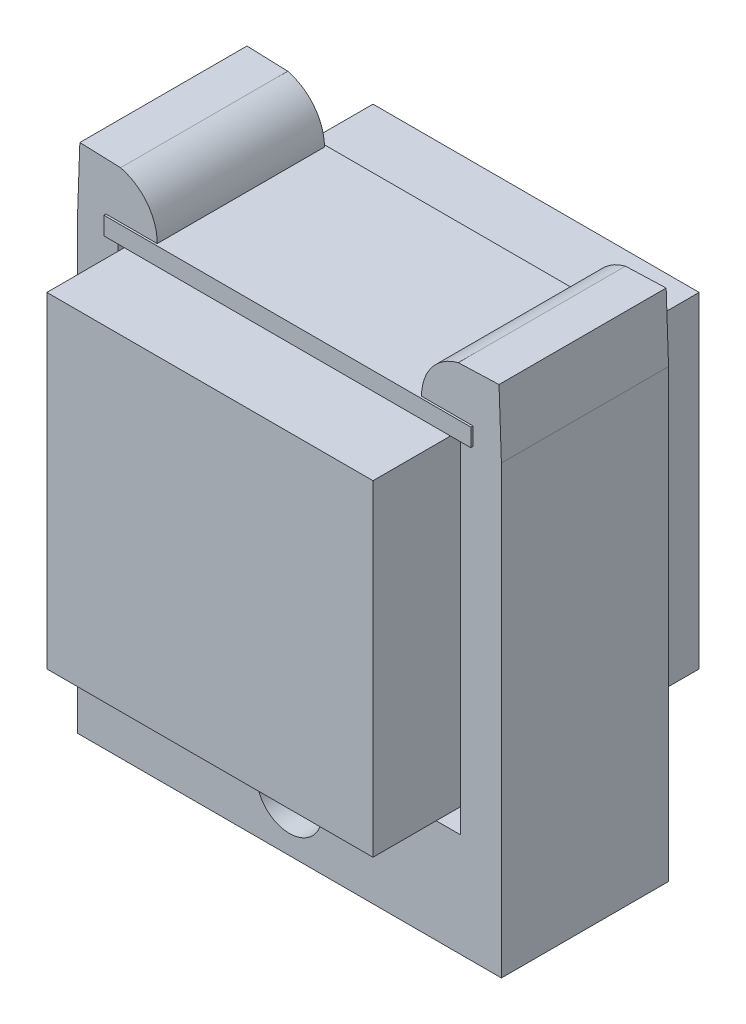
ISO-10303-21;
HEADER;
FILE_DESCRIPTION(('STEP AP214'),'2;1');
FILE_NAME('part.step','',(''),(''),'','','');
FILE_SCHEMA(('AUTOMOTIVE_DESIGN { 1 0 10303 214 1 1 1 1 }'));
ENDSEC;
DATA;
#1=APPLICATION_CONTEXT('core data for automotive mechanical design processes');
#2=APPLICATION_PROTOCOL_DEFINITION('international standard','automotive_design',2000,#1);
#3=PRODUCT_CONTEXT('',#1,'mechanical');
#4=PRODUCT('Part','Part','',(#3));
#5=PRODUCT_RELATED_PRODUCT_CATEGORY('part','',(#4));
#6=PRODUCT_DEFINITION_FORMATION('','',#4);
#7=PRODUCT_DEFINITION_CONTEXT('part definition',#1,'design');
#8=PRODUCT_DEFINITION('design','',#6,#7);
#9=PRODUCT_DEFINITION_SHAPE('','',#8);
#10=(LENGTH_UNIT() NAMED_UNIT(*) SI_UNIT(.MILLI.,.METRE.));
#11=(NAMED_UNIT(*) PLANE_ANGLE_UNIT() SI_UNIT($,.RADIAN.));
#12=(NAMED_UNIT(*) SI_UNIT($,.STERADIAN.) SOLID_ANGLE_UNIT());
#13=UNCERTAINTY_MEASURE_WITH_UNIT(LENGTH_MEASURE(1.E-05),#10,'distance_accuracy_value','');
#14=(GEOMETRIC_REPRESENTATION_CONTEXT(3) GLOBAL_UNCERTAINTY_ASSIGNED_CONTEXT((#13)) GLOBAL_UNIT_ASSIGNED_CONTEXT((#10,
#11,#12)) REPRESENTATION_CONTEXT('',''));
#15=CARTESIAN_POINT('',(0.,0.,0.));
#16=DIRECTION('',(0.,0.,1.));
#17=DIRECTION('',(1.,0.,0.));
#18=AXIS2_PLACEMENT_3D('',#15,#16,#17);
#19=CARTESIAN_POINT('',(-22.1592188142803,2.24280328604345,10.25));
#20=DIRECTION('',(0.,0.,-1.));
#21=DIRECTION('',(-1.,0.,0.));
#22=AXIS2_PLACEMENT_3D('',#19,#20,#21);
#23=CYLINDRICAL_SURFACE('',#22,5.95249624332241);
#24=CARTESIAN_POINT('',(-22.1592188142803,2.24280328604345,-10.25));
#25=DIRECTION('',(0.,0.,1.));
#26=DIRECTION('',(1.,0.,0.));
#27=AXIS2_PLACEMENT_3D('',#24,#25,#26);
#28=CIRCLE('',#27,5.95249624332241);
#29=CARTESIAN_POINT('',(-20.7105151780605,8.01631775308786,-10.25));
#30=VERTEX_POINT('',#29);
#31=CARTESIAN_POINT('',(-16.2105151780605,2.0303495847499,-10.25));
#32=VERTEX_POINT('',#31);
#33=EDGE_CURVE('E200',#30,#32,#28,.F.);
#34=ORIENTED_EDGE('',*,*,#33,.F.);
#35=DIRECTION('',(0.,0.,-1.));
#36=VECTOR('',#35,1.);
#37=CARTESIAN_POINT('',(-20.7105151780605,8.01631775308786,10.25));
#38=LINE('',#37,#36);
#39=CARTESIAN_POINT('',(-20.7105151780605,8.01631775308786,10.25));
#40=VERTEX_POINT('',#39);
#41=EDGE_CURVE('E12',#40,#30,#38,.T.);
#42=ORIENTED_EDGE('',*,*,#41,.F.);
#43=CARTESIAN_POINT('',(-22.1592188142803,2.24280328604345,10.25));
#44=DIRECTION('',(0.,0.,1.));
#45=DIRECTION('',(1.,0.,0.));
#46=AXIS2_PLACEMENT_3D('',#43,#44,#45);
#47=CIRCLE('',#46,5.95249624332241);
#48=CARTESIAN_POINT('',(-16.2105151780605,2.0303495847499,10.25));
#49=VERTEX_POINT('',#48);
#50=EDGE_CURVE('E243',#40,#49,#47,.F.);
#51=ORIENTED_EDGE('',*,*,#50,.T.);
#52=DIRECTION('',(0.,0.,-1.));
#53=VECTOR('',#52,1.);
#54=CARTESIAN_POINT('',(-16.2105151780605,2.0303495847499,10.25));
#55=LINE('',#54,#53);
#56=EDGE_CURVE('E71',#49,#32,#55,.T.);
#57=ORIENTED_EDGE('',*,*,#56,.T.);
#58=EDGE_LOOP('',(#34,#42,#51,#57));
#59=FACE_BOUND('',#58,.T.);
#60=ADVANCED_FACE('F55',(#59),#23,.T.);
#61=CARTESIAN_POINT('',(0.259549531093481,7.26738687061814,10.25));
#62=DIRECTION('',(0.0356915305124092,0.99936285434755,0.));
#63=DIRECTION('',(-0.99936285434755,0.0356915305124092,0.));
#64=AXIS2_PLACEMENT_3D('',#61,#62,#63);
#65=PLANE('',#64);
#66=DIRECTION('',(0.99936285434755,-0.0356915305124092,0.));
#67=VECTOR('',#66,1.);
#68=CARTESIAN_POINT('',(0.259549531093481,7.26738687061814,-10.25));
#69=LINE('',#68,#67);
#70=CARTESIAN_POINT('',(-25.7073294497982,8.1947754056499,-10.25));
#71=VERTEX_POINT('',#70);
#72=EDGE_CURVE('E202',#71,#30,#69,.T.);
#73=ORIENTED_EDGE('',*,*,#72,.F.);
#74=DIRECTION('',(0.,0.,-1.));
#75=VECTOR('',#74,1.);
#76=CARTESIAN_POINT('',(-25.7073294497982,8.1947754056499,10.25));
#77=LINE('',#76,#75);
#78=CARTESIAN_POINT('',(-25.7073294497982,8.1947754056499,10.25));
#79=VERTEX_POINT('',#78);
#80=EDGE_CURVE('E63',#79,#71,#77,.T.);
#81=ORIENTED_EDGE('',*,*,#80,.F.);
#82=DIRECTION('',(0.99936285434755,-0.0356915305124092,0.));
#83=VECTOR('',#82,1.);
#84=CARTESIAN_POINT('',(0.259549531093481,7.26738687061814,10.25));
#85=LINE('',#84,#83);
#86=EDGE_CURVE('E294',#79,#40,#85,.T.);
#87=ORIENTED_EDGE('',*,*,#86,.T.);
#88=ORIENTED_EDGE('',*,*,#41,.T.);
#89=EDGE_LOOP('',(#73,#81,#87,#88));
#90=FACE_BOUND('',#89,.T.);
#91=ADVANCED_FACE('F280',(#90),#65,.T.);
#92=CARTESIAN_POINT('',(-25.9668789808917,0.927388535031758,10.25));
#93=DIRECTION('',(-0.99936285434755,0.035691530512409,0.));
#94=DIRECTION('',(-0.035691530512409,-0.99936285434755,0.));
#95=AXIS2_PLACEMENT_3D('',#92,#93,#94);
#96=PLANE('',#95);
#97=DIRECTION('',(0.035691530512409,0.99936285434755,0.));
#98=VECTOR('',#97,1.);
#99=CARTESIAN_POINT('',(-25.9668789808917,0.927388535031758,-10.25));
#100=LINE('',#99,#98);
#101=CARTESIAN_POINT('',(-26.,0.,-10.25));
#102=VERTEX_POINT('',#101);
#103=EDGE_CURVE('E205',#102,#71,#100,.T.);
#104=ORIENTED_EDGE('',*,*,#103,.F.);
#105=DIRECTION('',(0.,0.,-1.));
#106=VECTOR('',#105,1.);
#107=CARTESIAN_POINT('',(-26.,0.,10.25));
#108=LINE('',#107,#106);
#109=CARTESIAN_POINT('',(-26.,0.,10.25));
#110=VERTEX_POINT('',#109);
#111=EDGE_CURVE('E269',#110,#102,#108,.T.);
#112=ORIENTED_EDGE('',*,*,#111,.F.);
#113=DIRECTION('',(0.035691530512409,0.99936285434755,0.));
#114=VECTOR('',#113,1.);
#115=CARTESIAN_POINT('',(-25.9668789808917,0.927388535031758,10.25));
#116=LINE('',#115,#114);
#117=EDGE_CURVE('E276',#110,#79,#116,.T.);
#118=ORIENTED_EDGE('',*,*,#117,.T.);
#119=ORIENTED_EDGE('',*,*,#80,.T.);
#120=EDGE_LOOP('',(#104,#112,#118,#119));
#121=FACE_BOUND('',#120,.T.);
#122=ADVANCED_FACE('F274',(#121),#96,.T.);
#123=CARTESIAN_POINT('',(-26.,0.,10.25));
#124=DIRECTION('',(-1.,0.,0.));
#125=DIRECTION('',(0.,0.,1.));
#126=AXIS2_PLACEMENT_3D('',#123,#124,#125);
#127=PLANE('',#126);
#128=DIRECTION('',(0.,1.,0.));
#129=VECTOR('',#128,1.);
#130=CARTESIAN_POINT('',(-26.,0.,-10.25));
#131=LINE('',#130,#129);
#132=CARTESIAN_POINT('',(-26.,-54.7,-10.25));
#133=VERTEX_POINT('',#132);
#134=EDGE_CURVE('E208',#133,#102,#131,.T.);
#135=ORIENTED_EDGE('',*,*,#134,.F.);
#136=DIRECTION('',(0.,0.,-1.));
#137=VECTOR('',#136,1.);
#138=CARTESIAN_POINT('',(-26.,-54.7,10.25));
#139=LINE('',#138,#137);
#140=CARTESIAN_POINT('',(-26.,-54.7,10.25));
#141=VERTEX_POINT('',#140);
#142=EDGE_CURVE('E267',#141,#133,#139,.T.);
#143=ORIENTED_EDGE('',*,*,#142,.F.);
#144=DIRECTION('',(0.,1.,0.));
#145=VECTOR('',#144,1.);
#146=CARTESIAN_POINT('',(-26.,0.,10.25));
#147=LINE('',#146,#145);
#148=EDGE_CURVE('E291',#141,#110,#147,.T.);
#149=ORIENTED_EDGE('',*,*,#148,.T.);
#150=ORIENTED_EDGE('',*,*,#111,.T.);
#151=EDGE_LOOP('',(#135,#143,#149,#150));
#152=FACE_BOUND('',#151,.T.);
#153=ADVANCED_FACE('F288',(#152),#127,.T.);
#154=CARTESIAN_POINT('',(0.,-54.7,10.25));
#155=DIRECTION('',(0.,-1.,0.));
#156=DIRECTION('',(0.,0.,-1.));
#157=AXIS2_PLACEMENT_3D('',#154,#155,#156);
#158=PLANE('',#157);
#159=DIRECTION('',(-1.,0.,0.));
#160=VECTOR('',#159,1.);
#161=CARTESIAN_POINT('',(0.,-54.7,-10.25));
#162=LINE('',#161,#160);
#163=CARTESIAN_POINT('',(26.,-54.7,-10.25));
#164=VERTEX_POINT('',#163);
#165=EDGE_CURVE('E211',#164,#133,#162,.T.);
#166=ORIENTED_EDGE('',*,*,#165,.F.);
#167=DIRECTION('',(0.,0.,-1.));
#168=VECTOR('',#167,1.);
#169=CARTESIAN_POINT('',(26.,-54.7,10.25));
#170=LINE('',#169,#168);
#171=CARTESIAN_POINT('',(26.,-54.7,10.25));
#172=VERTEX_POINT('',#171);
#173=EDGE_CURVE('E265',#172,#164,#170,.T.);
#174=ORIENTED_EDGE('',*,*,#173,.F.);
#175=DIRECTION('',(-1.,0.,0.));
#176=VECTOR('',#175,1.);
#177=CARTESIAN_POINT('',(0.,-54.7,10.25));
#178=LINE('',#177,#176);
#179=EDGE_CURVE('E296',#172,#141,#178,.T.);
#180=ORIENTED_EDGE('',*,*,#179,.T.);
#181=ORIENTED_EDGE('',*,*,#142,.T.);
#182=EDGE_LOOP('',(#166,#174,#180,#181));
#183=FACE_BOUND('',#182,.T.);
#184=ADVANCED_FACE('F343',(#183),#158,.T.);
#185=CARTESIAN_POINT('',(26.,0.,10.25));
#186=DIRECTION('',(-1.,0.,0.));
#187=DIRECTION('',(0.,0.,1.));
#188=AXIS2_PLACEMENT_3D('',#185,#186,#187);
#189=PLANE('',#188);
#190=DIRECTION('',(0.,1.,0.));
#191=VECTOR('',#190,1.);
#192=CARTESIAN_POINT('',(26.,0.,-10.25));
#193=LINE('',#192,#191);
#194=CARTESIAN_POINT('',(26.,0.,-10.25));
#195=VERTEX_POINT('',#194);
#196=EDGE_CURVE('E214',#164,#195,#193,.T.);
#197=ORIENTED_EDGE('',*,*,#196,.T.);
#198=DIRECTION('',(0.,0.,-1.));
#199=VECTOR('',#198,1.);
#200=CARTESIAN_POINT('',(26.,0.,10.25));
#201=LINE('',#200,#199);
#202=CARTESIAN_POINT('',(26.,0.,10.25));
#203=VERTEX_POINT('',#202);
#204=EDGE_CURVE('E262',#203,#195,#201,.T.);
#205=ORIENTED_EDGE('',*,*,#204,.F.);
#206=DIRECTION('',(0.,1.,0.));
#207=VECTOR('',#206,1.);
#208=CARTESIAN_POINT('',(26.,0.,10.25));
#209=LINE('',#208,#207);
#210=EDGE_CURVE('E302',#172,#203,#209,.T.);
#211=ORIENTED_EDGE('',*,*,#210,.F.);
#212=ORIENTED_EDGE('',*,*,#173,.T.);
#213=EDGE_LOOP('',(#197,#205,#211,#212));
#214=FACE_BOUND('',#213,.T.);
#215=ADVANCED_FACE('F346',(#214),#189,.F.);
#216=CARTESIAN_POINT('',(25.9668789808917,0.927388535031758,10.25));
#217=DIRECTION('',(-0.99936285434755,-0.035691530512409,0.));
#218=DIRECTION('',(0.035691530512409,-0.99936285434755,0.));
#219=AXIS2_PLACEMENT_3D('',#216,#217,#218);
#220=PLANE('',#219);
#221=DIRECTION('',(-0.035691530512409,0.99936285434755,0.));
#222=VECTOR('',#221,1.);
#223=CARTESIAN_POINT('',(25.9668789808917,0.927388535031758,-10.25));
#224=LINE('',#223,#222);
#225=CARTESIAN_POINT('',(25.7073294497982,8.1947754056499,-10.25));
#226=VERTEX_POINT('',#225);
#227=EDGE_CURVE('E216',#195,#226,#224,.T.);
#228=ORIENTED_EDGE('',*,*,#227,.T.);
#229=DIRECTION('',(0.,0.,-1.));
#230=VECTOR('',#229,1.);
#231=CARTESIAN_POINT('',(25.7073294497982,8.1947754056499,10.25));
#232=LINE('',#231,#230);
#233=CARTESIAN_POINT('',(25.7073294497982,8.1947754056499,10.25));
#234=VERTEX_POINT('',#233);
#235=EDGE_CURVE('E259',#234,#226,#232,.T.);
#236=ORIENTED_EDGE('',*,*,#235,.F.);
#237=DIRECTION('',(-0.035691530512409,0.99936285434755,0.));
#238=VECTOR('',#237,1.);
#239=CARTESIAN_POINT('',(25.9668789808917,0.927388535031758,10.25));
#240=LINE('',#239,#238);
#241=EDGE_CURVE('E304',#203,#234,#240,.T.);
#242=ORIENTED_EDGE('',*,*,#241,.F.);
#243=ORIENTED_EDGE('',*,*,#204,.T.);
#244=EDGE_LOOP('',(#228,#236,#242,#243));
#245=FACE_BOUND('',#244,.T.);
#246=ADVANCED_FACE('F350',(#245),#220,.F.);
#247=CARTESIAN_POINT('',(-0.259549531093481,7.26738687061814,10.25));
#248=DIRECTION('',(0.0356915305124092,-0.99936285434755,0.));
#249=DIRECTION('',(0.99936285434755,0.0356915305124092,0.));
#250=AXIS2_PLACEMENT_3D('',#247,#248,#249);
#251=PLANE('',#250);
#252=DIRECTION('',(-0.99936285434755,-0.0356915305124092,0.));
#253=VECTOR('',#252,1.);
#254=CARTESIAN_POINT('',(-0.259549531093481,7.26738687061814,-10.25));
#255=LINE('',#254,#253);
#256=CARTESIAN_POINT('',(20.7105151780605,8.01631775308786,-10.25));
#257=VERTEX_POINT('',#256);
#258=EDGE_CURVE('E218',#226,#257,#255,.T.);
#259=ORIENTED_EDGE('',*,*,#258,.T.);
#260=DIRECTION('',(0.,0.,-1.));
#261=VECTOR('',#260,1.);
#262=CARTESIAN_POINT('',(20.7105151780605,8.01631775308786,10.25));
#263=LINE('',#262,#261);
#264=CARTESIAN_POINT('',(20.7105151780605,8.01631775308786,10.25));
#265=VERTEX_POINT('',#264);
#266=EDGE_CURVE('E256',#265,#257,#263,.T.);
#267=ORIENTED_EDGE('',*,*,#266,.F.);
#268=DIRECTION('',(-0.99936285434755,-0.0356915305124092,0.));
#269=VECTOR('',#268,1.);
#270=CARTESIAN_POINT('',(-0.259549531093481,7.26738687061814,10.25));
#271=LINE('',#270,#269);
#272=EDGE_CURVE('E306',#234,#265,#271,.T.);
#273=ORIENTED_EDGE('',*,*,#272,.F.);
#274=ORIENTED_EDGE('',*,*,#235,.T.);
#275=EDGE_LOOP('',(#259,#267,#273,#274));
#276=FACE_BOUND('',#275,.T.);
#277=ADVANCED_FACE('F354',(#276),#251,.F.);
#278=CARTESIAN_POINT('',(22.1592188142803,2.24280328604345,10.25));
#279=DIRECTION('',(0.,0.,-1.));
#280=DIRECTION('',(-1.,0.,0.));
#281=AXIS2_PLACEMENT_3D('',#278,#279,#280);
#282=CYLINDRICAL_SURFACE('',#281,5.95249624332241);
#283=CARTESIAN_POINT('',(22.1592188142803,2.24280328604345,-10.25));
#284=DIRECTION('',(0.,0.,1.));
#285=DIRECTION('',(1.,0.,0.));
#286=AXIS2_PLACEMENT_3D('',#283,#284,#285);
#287=CIRCLE('',#286,5.95249624332241);
#288=CARTESIAN_POINT('',(16.2105151780605,2.0303495847499,-10.25));
#289=VERTEX_POINT('',#288);
#290=EDGE_CURVE('E220',#257,#289,#287,.T.);
#291=ORIENTED_EDGE('',*,*,#290,.T.);
#292=DIRECTION('',(0.,0.,-1.));
#293=VECTOR('',#292,1.);
#294=CARTESIAN_POINT('',(16.2105151780605,2.0303495847499,10.25));
#295=LINE('',#294,#293);
#296=CARTESIAN_POINT('',(16.2105151780605,2.0303495847499,10.25));
#297=VERTEX_POINT('',#296);
#298=EDGE_CURVE('E253',#297,#289,#295,.T.);
#299=ORIENTED_EDGE('',*,*,#298,.F.);
#300=CARTESIAN_POINT('',(22.1592188142803,2.24280328604345,10.25));
#301=DIRECTION('',(0.,0.,1.));
#302=DIRECTION('',(1.,0.,0.));
#303=AXIS2_PLACEMENT_3D('',#300,#301,#302);
#304=CIRCLE('',#303,5.95249624332241);
#305=EDGE_CURVE('E308',#265,#297,#304,.T.);
#306=ORIENTED_EDGE('',*,*,#305,.F.);
#307=ORIENTED_EDGE('',*,*,#266,.T.);
#308=EDGE_LOOP('',(#291,#299,#306,#307));
#309=FACE_BOUND('',#308,.T.);
#310=ADVANCED_FACE('F358',(#309),#282,.T.);
#311=CARTESIAN_POINT('',(-0.0517697747706173,1.44955369357742,10.25));
#312=DIRECTION('',(-0.0356915305124093,0.99936285434755,0.));
#313=DIRECTION('',(-0.99936285434755,-0.0356915305124093,0.));
#314=AXIS2_PLACEMENT_3D('',#311,#312,#313);
#315=PLANE('',#314);
#316=DIRECTION('',(0.99936285434755,0.0356915305124093,0.));
#317=VECTOR('',#316,1.);
#318=CARTESIAN_POINT('',(-0.0517697747706173,1.44955369357742,-10.25));
#319=LINE('',#318,#317);
#320=CARTESIAN_POINT('',(20.9214786328727,2.19859827956461,-10.25));
#321=VERTEX_POINT('',#320);
#322=EDGE_CURVE('E222',#289,#321,#319,.T.);
#323=ORIENTED_EDGE('',*,*,#322,.T.);
#324=DIRECTION('',(0.,0.,-1.));
#325=VECTOR('',#324,1.);
#326=CARTESIAN_POINT('',(20.9214786328727,2.19859827956461,10.25));
#327=LINE('',#326,#325);
#328=CARTESIAN_POINT('',(20.9214786328727,2.19859827956461,10.25));
#329=VERTEX_POINT('',#328);
#330=EDGE_CURVE('E251',#329,#321,#327,.T.);
#331=ORIENTED_EDGE('',*,*,#330,.F.);
#332=DIRECTION('',(0.99936285434755,0.0356915305124093,0.));
#333=VECTOR('',#332,1.);
#334=CARTESIAN_POINT('',(-0.0517697747706173,1.44955369357742,10.25));
#335=LINE('',#334,#333);
#336=EDGE_CURVE('E310',#297,#329,#335,.T.);
#337=ORIENTED_EDGE('',*,*,#336,.F.);
#338=ORIENTED_EDGE('',*,*,#298,.T.);
#339=EDGE_LOOP('',(#323,#331,#337,#338));
#340=FACE_BOUND('',#339,.T.);
#341=ADVANCED_FACE('F362',(#340),#315,.F.);
#342=CARTESIAN_POINT('',(20.9732484076433,0.749044585987179,10.25));
#343=DIRECTION('',(-0.99936285434755,-0.0356915305124086,0.));
#344=DIRECTION('',(0.0356915305124086,-0.99936285434755,0.));
#345=AXIS2_PLACEMENT_3D('',#342,#343,#344);
#346=PLANE('',#345);
#347=DIRECTION('',(-0.0356915305124086,0.99936285434755,0.));
#348=VECTOR('',#347,1.);
#349=CARTESIAN_POINT('',(20.9732484076433,0.749044585987179,-10.25));
#350=LINE('',#349,#348);
#351=CARTESIAN_POINT('',(21.,0.,-10.25));
#352=VERTEX_POINT('',#351);
#353=EDGE_CURVE('E225',#352,#321,#350,.T.);
#354=ORIENTED_EDGE('',*,*,#353,.F.);
#355=DIRECTION('',(0.,0.,-1.));
#356=VECTOR('',#355,1.);
#357=CARTESIAN_POINT('',(21.,0.,10.25));
#358=LINE('',#357,#356);
#359=CARTESIAN_POINT('',(21.,0.,10.25));
#360=VERTEX_POINT('',#359);
#361=EDGE_CURVE('E249',#360,#352,#358,.T.);
#362=ORIENTED_EDGE('',*,*,#361,.F.);
#363=DIRECTION('',(-0.0356915305124086,0.99936285434755,0.));
#364=VECTOR('',#363,1.);
#365=CARTESIAN_POINT('',(20.9732484076433,0.749044585987179,10.25));
#366=LINE('',#365,#364);
#367=EDGE_CURVE('E312',#360,#329,#366,.T.);
#368=ORIENTED_EDGE('',*,*,#367,.T.);
#369=ORIENTED_EDGE('',*,*,#330,.T.);
#370=EDGE_LOOP('',(#354,#362,#368,#369));
#371=FACE_BOUND('',#370,.T.);
#372=ADVANCED_FACE('F366',(#371),#346,.T.);
#373=CARTESIAN_POINT('',(21.,0.,10.25));
#374=DIRECTION('',(-1.,0.,0.));
#375=DIRECTION('',(0.,0.,1.));
#376=AXIS2_PLACEMENT_3D('',#373,#374,#375);
#377=PLANE('',#376);
#378=DIRECTION('',(0.,1.,0.));
#379=VECTOR('',#378,1.);
#380=CARTESIAN_POINT('',(21.,0.,-10.25));
#381=LINE('',#380,#379);
#382=CARTESIAN_POINT('',(21.,-42.,-10.25));
#383=VERTEX_POINT('',#382);
#384=EDGE_CURVE('E228',#383,#352,#381,.T.);
#385=ORIENTED_EDGE('',*,*,#384,.F.);
#386=DIRECTION('',(0.,0.,-1.));
#387=VECTOR('',#386,1.);
#388=CARTESIAN_POINT('',(21.,-42.,10.25));
#389=LINE('',#388,#387);
#390=CARTESIAN_POINT('',(21.,-42.,10.25));
#391=VERTEX_POINT('',#390);
#392=EDGE_CURVE('E247',#391,#383,#389,.T.);
#393=ORIENTED_EDGE('',*,*,#392,.F.);
#394=DIRECTION('',(0.,1.,0.));
#395=VECTOR('',#394,1.);
#396=CARTESIAN_POINT('',(21.,0.,10.25));
#397=LINE('',#396,#395);
#398=EDGE_CURVE('E315',#391,#360,#397,.T.);
#399=ORIENTED_EDGE('',*,*,#398,.T.);
#400=ORIENTED_EDGE('',*,*,#361,.T.);
#401=EDGE_LOOP('',(#385,#393,#399,#400));
#402=FACE_BOUND('',#401,.T.);
#403=ADVANCED_FACE('F370',(#402),#377,.T.);
#404=CARTESIAN_POINT('',(0.,-42.,10.25));
#405=DIRECTION('',(0.,1.,0.));
#406=DIRECTION('',(0.,0.,1.));
#407=AXIS2_PLACEMENT_3D('',#404,#405,#406);
#408=PLANE('',#407);
#409=DIRECTION('',(1.,0.,0.));
#410=VECTOR('',#409,1.);
#411=CARTESIAN_POINT('',(0.,-42.,-10.25));
#412=LINE('',#411,#410);
#413=CARTESIAN_POINT('',(-21.,-42.,-10.25));
#414=VERTEX_POINT('',#413);
#415=EDGE_CURVE('E231',#414,#383,#412,.T.);
#416=ORIENTED_EDGE('',*,*,#415,.F.);
#417=DIRECTION('',(0.,0.,-1.));
#418=VECTOR('',#417,1.);
#419=CARTESIAN_POINT('',(-21.,-42.,10.25));
#420=LINE('',#419,#418);
#421=CARTESIAN_POINT('',(-21.,-42.,10.25));
#422=VERTEX_POINT('',#421);
#423=EDGE_CURVE('E189',#422,#414,#420,.T.);
#424=ORIENTED_EDGE('',*,*,#423,.F.);
#425=DIRECTION('',(1.,0.,0.));
#426=VECTOR('',#425,1.);
#427=CARTESIAN_POINT('',(0.,-42.,10.25));
#428=LINE('',#427,#426);
#429=EDGE_CURVE('E179',#422,#391,#428,.T.);
#430=ORIENTED_EDGE('',*,*,#429,.T.);
#431=ORIENTED_EDGE('',*,*,#392,.T.);
#432=EDGE_LOOP('',(#416,#424,#430,#431));
#433=FACE_BOUND('',#432,.T.);
#434=ADVANCED_FACE('F319',(#433),#408,.T.);
#435=CARTESIAN_POINT('',(-21.,0.,10.25));
#436=DIRECTION('',(-1.,0.,0.));
#437=DIRECTION('',(0.,0.,1.));
#438=AXIS2_PLACEMENT_3D('',#435,#436,#437);
#439=PLANE('',#438);
#440=DIRECTION('',(0.,1.,0.));
#441=VECTOR('',#440,1.);
#442=CARTESIAN_POINT('',(-21.,0.,-10.25));
#443=LINE('',#442,#441);
#444=CARTESIAN_POINT('',(-21.,0.,-10.25));
#445=VERTEX_POINT('',#444);
#446=EDGE_CURVE('E186',#414,#445,#443,.T.);
#447=ORIENTED_EDGE('',*,*,#446,.T.);
#448=DIRECTION('',(0.,0.,-1.));
#449=VECTOR('',#448,1.);
#450=CARTESIAN_POINT('',(-21.,0.,10.25));
#451=LINE('',#450,#449);
#452=CARTESIAN_POINT('',(-21.,0.,10.25));
#453=VERTEX_POINT('',#452);
#454=EDGE_CURVE('E183',#453,#445,#451,.T.);
#455=ORIENTED_EDGE('',*,*,#454,.F.);
#456=DIRECTION('',(0.,1.,0.));
#457=VECTOR('',#456,1.);
#458=CARTESIAN_POINT('',(-21.,0.,10.25));
#459=LINE('',#458,#457);
#460=EDGE_CURVE('E170',#422,#453,#459,.T.);
#461=ORIENTED_EDGE('',*,*,#460,.F.);
#462=ORIENTED_EDGE('',*,*,#423,.T.);
#463=EDGE_LOOP('',(#447,#455,#461,#462));
#464=FACE_BOUND('',#463,.T.);
#465=ADVANCED_FACE('F184',(#464),#439,.F.);
#466=CARTESIAN_POINT('',(-20.9732484076433,0.749044585987146,10.25));
#467=DIRECTION('',(-0.99936285434755,0.035691530512407,0.));
#468=DIRECTION('',(-0.035691530512407,-0.99936285434755,0.));
#469=AXIS2_PLACEMENT_3D('',#466,#467,#468);
#470=PLANE('',#469);
#471=DIRECTION('',(0.035691530512407,0.99936285434755,0.));
#472=VECTOR('',#471,1.);
#473=CARTESIAN_POINT('',(-20.9732484076433,0.749044585987146,-10.25));
#474=LINE('',#473,#472);
#475=CARTESIAN_POINT('',(-20.9214786328727,2.19859827956461,-10.25));
#476=VERTEX_POINT('',#475);
#477=EDGE_CURVE('E235',#445,#476,#474,.T.);
#478=ORIENTED_EDGE('',*,*,#477,.T.);
#479=DIRECTION('',(0.,0.,-1.));
#480=VECTOR('',#479,1.);
#481=CARTESIAN_POINT('',(-20.9214786328727,2.19859827956461,10.25));
#482=LINE('',#481,#480);
#483=CARTESIAN_POINT('',(-20.9214786328727,2.19859827956461,10.25));
#484=VERTEX_POINT('',#483);
#485=EDGE_CURVE('E121',#484,#476,#482,.T.);
#486=ORIENTED_EDGE('',*,*,#485,.F.);
#487=DIRECTION('',(0.035691530512407,0.99936285434755,0.));
#488=VECTOR('',#487,1.);
#489=CARTESIAN_POINT('',(-20.9732484076433,0.749044585987146,10.25));
#490=LINE('',#489,#488);
#491=EDGE_CURVE('E176',#453,#484,#490,.T.);
#492=ORIENTED_EDGE('',*,*,#491,.F.);
#493=ORIENTED_EDGE('',*,*,#454,.T.);
#494=EDGE_LOOP('',(#478,#486,#492,#493));
#495=FACE_BOUND('',#494,.T.);
#496=ADVANCED_FACE('F191',(#495),#470,.F.);
#497=CARTESIAN_POINT('',(0.0517697747706173,1.44955369357742,10.25));
#498=DIRECTION('',(-0.0356915305124093,-0.99936285434755,0.));
#499=DIRECTION('',(0.99936285434755,-0.0356915305124093,0.));
#500=AXIS2_PLACEMENT_3D('',#497,#498,#499);
#501=PLANE('',#500);
#502=DIRECTION('',(-0.99936285434755,0.0356915305124093,0.));
#503=VECTOR('',#502,1.);
#504=CARTESIAN_POINT('',(0.0517697747706173,1.44955369357742,-10.25));
#505=LINE('',#504,#503);
#506=EDGE_CURVE('E237',#32,#476,#505,.T.);
#507=ORIENTED_EDGE('',*,*,#506,.F.);
#508=ORIENTED_EDGE('',*,*,#56,.F.);
#509=DIRECTION('',(-0.99936285434755,0.0356915305124093,0.));
#510=VECTOR('',#509,1.);
#511=CARTESIAN_POINT('',(0.0517697747706173,1.44955369357742,10.25));
#512=LINE('',#511,#510);
#513=EDGE_CURVE('E192',#49,#484,#512,.T.);
#514=ORIENTED_EDGE('',*,*,#513,.T.);
#515=ORIENTED_EDGE('',*,*,#485,.T.);
#516=EDGE_LOOP('',(#507,#508,#514,#515));
#517=FACE_BOUND('',#516,.T.);
#518=ADVANCED_FACE('F321',(#517),#501,.T.);
#519=CARTESIAN_POINT('',(0.,-48.35,10.25));
#520=DIRECTION('',(0.,0.,-1.));
#521=DIRECTION('',(-1.,0.,0.));
#522=AXIS2_PLACEMENT_3D('',#519,#520,#521);
#523=CYLINDRICAL_SURFACE('',#522,4.);
#524=CARTESIAN_POINT('',(0.,-48.35,10.25));
#525=DIRECTION('',(0.,0.,1.));
#526=DIRECTION('',(1.,0.,0.));
#527=AXIS2_PLACEMENT_3D('',#524,#525,#526);
#528=CIRCLE('',#527,4.);
#529=CARTESIAN_POINT('',(4.,-48.35,10.25));
#530=VERTEX_POINT('',#529);
#531=EDGE_CURVE('E194',#530,#530,#528,.T.);
#532=ORIENTED_EDGE('',*,*,#531,.T.);
#533=EDGE_LOOP('',(#532));
#534=FACE_BOUND('',#533,.T.);
#535=CARTESIAN_POINT('',(0.,-48.35,-10.25));
#536=DIRECTION('',(0.,0.,1.));
#537=DIRECTION('',(1.,0.,0.));
#538=AXIS2_PLACEMENT_3D('',#535,#536,#537);
#539=CIRCLE('',#538,4.);
#540=CARTESIAN_POINT('',(4.,-48.35,-10.25));
#541=VERTEX_POINT('',#540);
#542=EDGE_CURVE('E240',#541,#541,#539,.T.);
#543=ORIENTED_EDGE('',*,*,#542,.F.);
#544=EDGE_LOOP('',(#543));
#545=FACE_BOUND('',#544,.T.);
#546=ADVANCED_FACE('F323',(#534,#545),#523,.F.);
#547=CARTESIAN_POINT('',(0.,0.,10.25));
#548=DIRECTION('',(0.,0.,1.));
#549=DIRECTION('',(1.,0.,0.));
#550=AXIS2_PLACEMENT_3D('',#547,#548,#549);
#551=PLANE('',#550);
#552=ORIENTED_EDGE('',*,*,#50,.F.);
#553=ORIENTED_EDGE('',*,*,#86,.F.);
#554=ORIENTED_EDGE('',*,*,#117,.F.);
#555=ORIENTED_EDGE('',*,*,#148,.F.);
#556=ORIENTED_EDGE('',*,*,#179,.F.);
#557=ORIENTED_EDGE('',*,*,#210,.T.);
#558=ORIENTED_EDGE('',*,*,#241,.T.);
#559=ORIENTED_EDGE('',*,*,#272,.T.);
#560=ORIENTED_EDGE('',*,*,#305,.T.);
#561=ORIENTED_EDGE('',*,*,#336,.T.);
#562=ORIENTED_EDGE('',*,*,#367,.F.);
#563=ORIENTED_EDGE('',*,*,#398,.F.);
#564=ORIENTED_EDGE('',*,*,#429,.F.);
#565=ORIENTED_EDGE('',*,*,#460,.T.);
#566=ORIENTED_EDGE('',*,*,#491,.T.);
#567=ORIENTED_EDGE('',*,*,#513,.F.);
#568=EDGE_LOOP('',(#552,#553,#554,#555,#556,#557,#558,#559,#560,#561,#562,#563,#564,#565,#566,#567));
#569=FACE_BOUND('',#568,.T.);
#570=ORIENTED_EDGE('',*,*,#531,.F.);
#571=EDGE_LOOP('',(#570));
#572=FACE_BOUND('',#571,.T.);
#573=ADVANCED_FACE('F172',(#569,#572),#551,.T.);
#574=CARTESIAN_POINT('',(0.,0.,-10.25));
#575=DIRECTION('',(0.,0.,1.));
#576=DIRECTION('',(1.,0.,0.));
#577=AXIS2_PLACEMENT_3D('',#574,#575,#576);
#578=PLANE('',#577);
#579=ORIENTED_EDGE('',*,*,#33,.T.);
#580=ORIENTED_EDGE('',*,*,#506,.T.);
#581=ORIENTED_EDGE('',*,*,#477,.F.);
#582=ORIENTED_EDGE('',*,*,#446,.F.);
#583=ORIENTED_EDGE('',*,*,#415,.T.);
#584=ORIENTED_EDGE('',*,*,#384,.T.);
#585=ORIENTED_EDGE('',*,*,#353,.T.);
#586=ORIENTED_EDGE('',*,*,#322,.F.);
#587=ORIENTED_EDGE('',*,*,#290,.F.);
#588=ORIENTED_EDGE('',*,*,#258,.F.);
#589=ORIENTED_EDGE('',*,*,#227,.F.);
#590=ORIENTED_EDGE('',*,*,#196,.F.);
#591=ORIENTED_EDGE('',*,*,#165,.T.);
#592=ORIENTED_EDGE('',*,*,#134,.T.);
#593=ORIENTED_EDGE('',*,*,#103,.T.);
#594=ORIENTED_EDGE('',*,*,#72,.T.);
#595=EDGE_LOOP('',(#579,#580,#581,#582,#583,#584,#585,#586,#587,#588,#589,#590,#591,#592,#593,#594));
#596=FACE_BOUND('',#595,.T.);
#597=ORIENTED_EDGE('',*,*,#542,.T.);
#598=EDGE_LOOP('',(#597));
#599=FACE_BOUND('',#598,.T.);
#600=ADVANCED_FACE('F282',(#596,#599),#578,.F.);
#601=CLOSED_SHELL('',(#60,#91,#122,#153,#184,#215,#246,#277,#310,#341,#372,#403,#434,#465,#496,
#518,#546,#573,#600));
#602=MANIFOLD_SOLID_BREP('B2',#601);
#603=CARTESIAN_POINT('',(20.,-40.,20.));
#604=DIRECTION('',(1.,0.,0.));
#605=DIRECTION('',(0.,0.,-1.));
#606=AXIS2_PLACEMENT_3D('',#603,#604,#605);
#607=PLANE('',#606);
#608=DIRECTION('',(0.,0.,-1.));
#609=VECTOR('',#608,1.);
#610=CARTESIAN_POINT('',(20.,0.,20.));
#611=LINE('',#610,#609);
#612=CARTESIAN_POINT('',(20.,0.,20.));
#613=VERTEX_POINT('',#612);
#614=CARTESIAN_POINT('',(20.,0.,-20.));
#615=VERTEX_POINT('',#614);
#616=EDGE_CURVE('E653',#613,#615,#611,.T.);
#617=ORIENTED_EDGE('',*,*,#616,.F.);
#618=DIRECTION('',(0.,1.,0.));
#619=VECTOR('',#618,1.);
#620=CARTESIAN_POINT('',(20.,-40.,20.));
#621=LINE('',#620,#619);
#622=CARTESIAN_POINT('',(20.,-40.,20.));
#623=VERTEX_POINT('',#622);
#624=EDGE_CURVE('E53',#623,#613,#621,.T.);
#625=ORIENTED_EDGE('',*,*,#624,.F.);
#626=DIRECTION('',(0.,0.,-1.));
#627=VECTOR('',#626,1.);
#628=CARTESIAN_POINT('',(20.,-40.,20.));
#629=LINE('',#628,#627);
#630=CARTESIAN_POINT('',(20.,-40.,-20.));
#631=VERTEX_POINT('',#630);
#632=EDGE_CURVE('E645',#623,#631,#629,.T.);
#633=ORIENTED_EDGE('',*,*,#632,.T.);
#634=DIRECTION('',(0.,1.,0.));
#635=VECTOR('',#634,1.);
#636=CARTESIAN_POINT('',(20.,-40.,-20.));
#637=LINE('',#636,#635);
#638=EDGE_CURVE('E586',#631,#615,#637,.T.);
#639=ORIENTED_EDGE('',*,*,#638,.T.);
#640=EDGE_LOOP('',(#617,#625,#633,#639));
#641=FACE_BOUND('',#640,.T.);
#642=ADVANCED_FACE('F583',(#641),#607,.T.);
#643=CARTESIAN_POINT('',(-20.,-40.,20.));
#644=DIRECTION('',(0.,0.,1.));
#645=DIRECTION('',(1.,0.,0.));
#646=AXIS2_PLACEMENT_3D('',#643,#644,#645);
#647=PLANE('',#646);
#648=DIRECTION('',(1.,0.,0.));
#649=VECTOR('',#648,1.);
#650=CARTESIAN_POINT('',(-20.,0.,20.));
#651=LINE('',#650,#649);
#652=CARTESIAN_POINT('',(-20.,0.,20.));
#653=VERTEX_POINT('',#652);
#654=EDGE_CURVE('E648',#653,#613,#651,.T.);
#655=ORIENTED_EDGE('',*,*,#654,.F.);
#656=DIRECTION('',(0.,1.,0.));
#657=VECTOR('',#656,1.);
#658=CARTESIAN_POINT('',(-20.,-40.,20.));
#659=LINE('',#658,#657);
#660=CARTESIAN_POINT('',(-20.,-40.,20.));
#661=VERTEX_POINT('',#660);
#662=EDGE_CURVE('E593',#661,#653,#659,.T.);
#663=ORIENTED_EDGE('',*,*,#662,.F.);
#664=DIRECTION('',(1.,0.,0.));
#665=VECTOR('',#664,1.);
#666=CARTESIAN_POINT('',(-20.,-40.,20.));
#667=LINE('',#666,#665);
#668=EDGE_CURVE('E640',#661,#623,#667,.T.);
#669=ORIENTED_EDGE('',*,*,#668,.T.);
#670=ORIENTED_EDGE('',*,*,#624,.T.);
#671=EDGE_LOOP('',(#655,#663,#669,#670));
#672=FACE_BOUND('',#671,.T.);
#673=ADVANCED_FACE('F669',(#672),#647,.T.);
#674=CARTESIAN_POINT('',(-20.,-40.,20.));
#675=DIRECTION('',(-1.,0.,0.));
#676=DIRECTION('',(0.,0.,1.));
#677=AXIS2_PLACEMENT_3D('',#674,#675,#676);
#678=PLANE('',#677);
#679=DIRECTION('',(0.,0.,1.));
#680=VECTOR('',#679,1.);
#681=CARTESIAN_POINT('',(-20.,0.,20.));
#682=LINE('',#681,#680);
#683=CARTESIAN_POINT('',(-20.,0.,-20.));
#684=VERTEX_POINT('',#683);
#685=EDGE_CURVE('E634',#684,#653,#682,.T.);
#686=ORIENTED_EDGE('',*,*,#685,.F.);
#687=DIRECTION('',(0.,1.,0.));
#688=VECTOR('',#687,1.);
#689=CARTESIAN_POINT('',(-20.,-40.,-20.));
#690=LINE('',#689,#688);
#691=CARTESIAN_POINT('',(-20.,-40.,-20.));
#692=VERTEX_POINT('',#691);
#693=EDGE_CURVE('E629',#692,#684,#690,.T.);
#694=ORIENTED_EDGE('',*,*,#693,.F.);
#695=DIRECTION('',(0.,0.,1.));
#696=VECTOR('',#695,1.);
#697=CARTESIAN_POINT('',(-20.,-40.,20.));
#698=LINE('',#697,#696);
#699=EDGE_CURVE('E632',#692,#661,#698,.T.);
#700=ORIENTED_EDGE('',*,*,#699,.T.);
#701=ORIENTED_EDGE('',*,*,#662,.T.);
#702=EDGE_LOOP('',(#686,#694,#700,#701));
#703=FACE_BOUND('',#702,.T.);
#704=ADVANCED_FACE('F631',(#703),#678,.T.);
#705=CARTESIAN_POINT('',(-20.,-40.,-20.));
#706=DIRECTION('',(0.,0.,-1.));
#707=DIRECTION('',(-1.,0.,0.));
#708=AXIS2_PLACEMENT_3D('',#705,#706,#707);
#709=PLANE('',#708);
#710=DIRECTION('',(-1.,0.,0.));
#711=VECTOR('',#710,1.);
#712=CARTESIAN_POINT('',(-20.,0.,-20.));
#713=LINE('',#712,#711);
#714=EDGE_CURVE('E657',#615,#684,#713,.T.);
#715=ORIENTED_EDGE('',*,*,#714,.F.);
#716=ORIENTED_EDGE('',*,*,#638,.F.);
#717=DIRECTION('',(-1.,0.,0.));
#718=VECTOR('',#717,1.);
#719=CARTESIAN_POINT('',(-20.,-40.,-20.));
#720=LINE('',#719,#718);
#721=EDGE_CURVE('E639',#631,#692,#720,.T.);
#722=ORIENTED_EDGE('',*,*,#721,.T.);
#723=ORIENTED_EDGE('',*,*,#693,.T.);
#724=EDGE_LOOP('',(#715,#716,#722,#723));
#725=FACE_BOUND('',#724,.T.);
#726=ADVANCED_FACE('F643',(#725),#709,.T.);
#727=CARTESIAN_POINT('',(0.,-40.,0.));
#728=DIRECTION('',(0.,-1.,0.));
#729=DIRECTION('',(0.,0.,-1.));
#730=AXIS2_PLACEMENT_3D('',#727,#728,#729);
#731=PLANE('',#730);
#732=ORIENTED_EDGE('',*,*,#632,.F.);
#733=ORIENTED_EDGE('',*,*,#668,.F.);
#734=ORIENTED_EDGE('',*,*,#699,.F.);
#735=ORIENTED_EDGE('',*,*,#721,.F.);
#736=EDGE_LOOP('',(#732,#733,#734,#735));
#737=FACE_BOUND('',#736,.T.);
#738=ADVANCED_FACE('F638',(#737),#731,.T.);
#739=CARTESIAN_POINT('',(0.,0.,0.));
#740=DIRECTION('',(0.,-1.,0.));
#741=DIRECTION('',(0.,0.,-1.));
#742=AXIS2_PLACEMENT_3D('',#739,#740,#741);
#743=PLANE('',#742);
#744=ORIENTED_EDGE('',*,*,#616,.T.);
#745=ORIENTED_EDGE('',*,*,#714,.T.);
#746=ORIENTED_EDGE('',*,*,#685,.T.);
#747=ORIENTED_EDGE('',*,*,#654,.T.);
#748=EDGE_LOOP('',(#744,#745,#746,#747));
#749=FACE_BOUND('',#748,.T.);
#750=ADVANCED_FACE('F668',(#749),#743,.F.);
#751=CLOSED_SHELL('',(#642,#673,#704,#726,#738,#750));
#752=MANIFOLD_SOLID_BREP('B6',#751);
#753=CARTESIAN_POINT('',(22.5,2.2,10.5));
#754=DIRECTION('',(-1.,0.,0.));
#755=DIRECTION('',(0.,0.,1.));
#756=AXIS2_PLACEMENT_3D('',#753,#754,#755);
#757=PLANE('',#756);
#758=DIRECTION('',(0.,0.,-1.));
#759=VECTOR('',#758,1.);
#760=CARTESIAN_POINT('',(22.5,0.,10.5));
#761=LINE('',#760,#759);
#762=CARTESIAN_POINT('',(22.5,0.,10.5));
#763=VERTEX_POINT('',#762);
#764=CARTESIAN_POINT('',(22.5,0.,-10.5));
#765=VERTEX_POINT('',#764);
#766=EDGE_CURVE('E793',#763,#765,#761,.T.);
#767=ORIENTED_EDGE('',*,*,#766,.T.);
#768=DIRECTION('',(0.,-1.,0.));
#769=VECTOR('',#768,1.);
#770=CARTESIAN_POINT('',(22.5,2.2,-10.5));
#771=LINE('',#770,#769);
#772=CARTESIAN_POINT('',(22.5,2.2,-10.5));
#773=VERTEX_POINT('',#772);
#774=EDGE_CURVE('E581',#773,#765,#771,.T.);
#775=ORIENTED_EDGE('',*,*,#774,.F.);
#776=DIRECTION('',(0.,0.,-1.));
#777=VECTOR('',#776,1.);
#778=CARTESIAN_POINT('',(22.5,2.2,10.5));
#779=LINE('',#778,#777);
#780=CARTESIAN_POINT('',(22.5,2.2,10.5));
#781=VERTEX_POINT('',#780);
#782=EDGE_CURVE('E781',#781,#773,#779,.T.);
#783=ORIENTED_EDGE('',*,*,#782,.F.);
#784=DIRECTION('',(0.,-1.,0.));
#785=VECTOR('',#784,1.);
#786=CARTESIAN_POINT('',(22.5,2.2,10.5));
#787=LINE('',#786,#785);
#788=EDGE_CURVE('E789',#781,#763,#787,.T.);
#789=ORIENTED_EDGE('',*,*,#788,.T.);
#790=EDGE_LOOP('',(#767,#775,#783,#789));
#791=FACE_BOUND('',#790,.T.);
#792=ADVANCED_FACE('F730',(#791),#757,.F.);
#793=CARTESIAN_POINT('',(-22.5,2.2,-10.5));
#794=DIRECTION('',(0.,0.,1.));
#795=DIRECTION('',(1.,0.,0.));
#796=AXIS2_PLACEMENT_3D('',#793,#794,#795);
#797=PLANE('',#796);
#798=DIRECTION('',(-1.,0.,0.));
#799=VECTOR('',#798,1.);
#800=CARTESIAN_POINT('',(-22.5,0.,-10.5));
#801=LINE('',#800,#799);
#802=CARTESIAN_POINT('',(-22.5,0.,-10.5));
#803=VERTEX_POINT('',#802);
#804=EDGE_CURVE('E785',#765,#803,#801,.T.);
#805=ORIENTED_EDGE('',*,*,#804,.T.);
#806=DIRECTION('',(0.,-1.,0.));
#807=VECTOR('',#806,1.);
#808=CARTESIAN_POINT('',(-22.5,2.2,-10.5));
#809=LINE('',#808,#807);
#810=CARTESIAN_POINT('',(-22.5,2.2,-10.5));
#811=VERTEX_POINT('',#810);
#812=EDGE_CURVE('E738',#811,#803,#809,.T.);
#813=ORIENTED_EDGE('',*,*,#812,.F.);
#814=DIRECTION('',(-1.,0.,0.));
#815=VECTOR('',#814,1.);
#816=CARTESIAN_POINT('',(-22.5,2.2,-10.5));
#817=LINE('',#816,#815);
#818=EDGE_CURVE('E776',#773,#811,#817,.T.);
#819=ORIENTED_EDGE('',*,*,#818,.F.);
#820=ORIENTED_EDGE('',*,*,#774,.T.);
#821=EDGE_LOOP('',(#805,#813,#819,#820));
#822=FACE_BOUND('',#821,.T.);
#823=ADVANCED_FACE('F784',(#822),#797,.F.);
#824=CARTESIAN_POINT('',(-22.5,2.2,10.5));
#825=DIRECTION('',(1.,0.,0.));
#826=DIRECTION('',(0.,0.,-1.));
#827=AXIS2_PLACEMENT_3D('',#824,#825,#826);
#828=PLANE('',#827);
#829=DIRECTION('',(0.,0.,1.));
#830=VECTOR('',#829,1.);
#831=CARTESIAN_POINT('',(-22.5,0.,10.5));
#832=LINE('',#831,#830);
#833=CARTESIAN_POINT('',(-22.5,0.,10.5));
#834=VERTEX_POINT('',#833);
#835=EDGE_CURVE('E763',#803,#834,#832,.T.);
#836=ORIENTED_EDGE('',*,*,#835,.T.);
#837=DIRECTION('',(0.,-1.,0.));
#838=VECTOR('',#837,1.);
#839=CARTESIAN_POINT('',(-22.5,2.2,10.5));
#840=LINE('',#839,#838);
#841=CARTESIAN_POINT('',(-22.5,2.2,10.5));
#842=VERTEX_POINT('',#841);
#843=EDGE_CURVE('E786',#842,#834,#840,.T.);
#844=ORIENTED_EDGE('',*,*,#843,.F.);
#845=DIRECTION('',(0.,0.,1.));
#846=VECTOR('',#845,1.);
#847=CARTESIAN_POINT('',(-22.5,2.2,10.5));
#848=LINE('',#847,#846);
#849=EDGE_CURVE('E779',#811,#842,#848,.T.);
#850=ORIENTED_EDGE('',*,*,#849,.F.);
#851=ORIENTED_EDGE('',*,*,#812,.T.);
#852=EDGE_LOOP('',(#836,#844,#850,#851));
#853=FACE_BOUND('',#852,.T.);
#854=ADVANCED_FACE('F787',(#853),#828,.F.);
#855=CARTESIAN_POINT('',(-22.5,2.2,10.5));
#856=DIRECTION('',(0.,0.,-1.));
#857=DIRECTION('',(-1.,0.,0.));
#858=AXIS2_PLACEMENT_3D('',#855,#856,#857);
#859=PLANE('',#858);
#860=DIRECTION('',(1.,0.,0.));
#861=VECTOR('',#860,1.);
#862=CARTESIAN_POINT('',(-22.5,0.,10.5));
#863=LINE('',#862,#861);
#864=EDGE_CURVE('E769',#834,#763,#863,.T.);
#865=ORIENTED_EDGE('',*,*,#864,.T.);
#866=ORIENTED_EDGE('',*,*,#788,.F.);
#867=DIRECTION('',(1.,0.,0.));
#868=VECTOR('',#867,1.);
#869=CARTESIAN_POINT('',(-22.5,2.2,10.5));
#870=LINE('',#869,#868);
#871=EDGE_CURVE('E746',#842,#781,#870,.T.);
#872=ORIENTED_EDGE('',*,*,#871,.F.);
#873=ORIENTED_EDGE('',*,*,#843,.T.);
#874=EDGE_LOOP('',(#865,#866,#872,#873));
#875=FACE_BOUND('',#874,.T.);
#876=ADVANCED_FACE('F800',(#875),#859,.F.);
#877=CARTESIAN_POINT('',(0.,2.2,0.));
#878=DIRECTION('',(0.,-1.,0.));
#879=DIRECTION('',(0.,0.,-1.));
#880=AXIS2_PLACEMENT_3D('',#877,#878,#879);
#881=PLANE('',#880);
#882=ORIENTED_EDGE('',*,*,#782,.T.);
#883=ORIENTED_EDGE('',*,*,#818,.T.);
#884=ORIENTED_EDGE('',*,*,#849,.T.);
#885=ORIENTED_EDGE('',*,*,#871,.T.);
#886=EDGE_LOOP('',(#882,#883,#884,#885));
#887=FACE_BOUND('',#886,.T.);
#888=ADVANCED_FACE('F777',(#887),#881,.F.);
#889=CARTESIAN_POINT('',(0.,0.,0.));
#890=DIRECTION('',(0.,-1.,0.));
#891=DIRECTION('',(0.,0.,-1.));
#892=AXIS2_PLACEMENT_3D('',#889,#890,#891);
#893=PLANE('',#892);
#894=ORIENTED_EDGE('',*,*,#766,.F.);
#895=ORIENTED_EDGE('',*,*,#864,.F.);
#896=ORIENTED_EDGE('',*,*,#835,.F.);
#897=ORIENTED_EDGE('',*,*,#804,.F.);
#898=EDGE_LOOP('',(#894,#895,#896,#897));
#899=FACE_BOUND('',#898,.T.);
#900=ADVANCED_FACE('F803',(#899),#893,.T.);
#901=CLOSED_SHELL('',(#792,#823,#854,#876,#888,#900));
#902=MANIFOLD_SOLID_BREP('B47',#901);
#903=ADVANCED_BREP_SHAPE_REPRESENTATION('',(#18,#602,#752,#902),#14);
#904=SHAPE_DEFINITION_REPRESENTATION(#9,#903);
ENDSEC;
END-ISO-10303-21;
